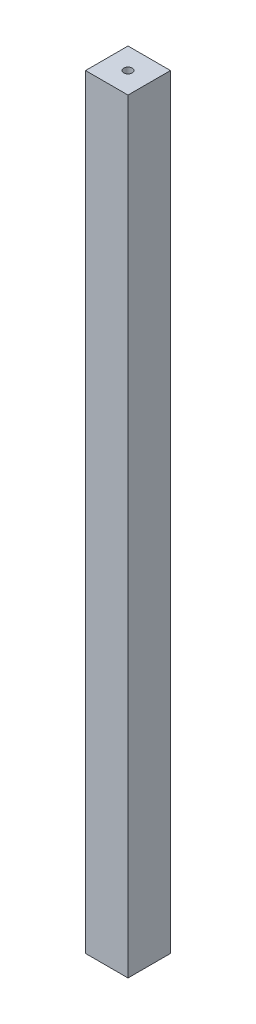
ISO-10303-21;
HEADER;
FILE_DESCRIPTION(('STEP AP214'),'2;1');
FILE_NAME('part.step','',(''),(''),'','','');
FILE_SCHEMA(('AUTOMOTIVE_DESIGN { 1 0 10303 214 1 1 1 1 }'));
ENDSEC;
DATA;
#1=APPLICATION_CONTEXT('core data for automotive mechanical design processes');
#2=APPLICATION_PROTOCOL_DEFINITION('international standard','automotive_design',2000,#1);
#3=PRODUCT_CONTEXT('',#1,'mechanical');
#4=PRODUCT('Part','Part','',(#3));
#5=PRODUCT_RELATED_PRODUCT_CATEGORY('part','',(#4));
#6=PRODUCT_DEFINITION_FORMATION('','',#4);
#7=PRODUCT_DEFINITION_CONTEXT('part definition',#1,'design');
#8=PRODUCT_DEFINITION('design','',#6,#7);
#9=PRODUCT_DEFINITION_SHAPE('','',#8);
#10=(LENGTH_UNIT() NAMED_UNIT(*) SI_UNIT(.MILLI.,.METRE.));
#11=(NAMED_UNIT(*) PLANE_ANGLE_UNIT() SI_UNIT($,.RADIAN.));
#12=(NAMED_UNIT(*) SI_UNIT($,.STERADIAN.) SOLID_ANGLE_UNIT());
#13=UNCERTAINTY_MEASURE_WITH_UNIT(LENGTH_MEASURE(1.E-05),#10,'distance_accuracy_value','');
#14=(GEOMETRIC_REPRESENTATION_CONTEXT(3) GLOBAL_UNCERTAINTY_ASSIGNED_CONTEXT((#13)) GLOBAL_UNIT_ASSIGNED_CONTEXT((#10,
#11,#12)) REPRESENTATION_CONTEXT('',''));
#15=CARTESIAN_POINT('',(0.,0.,0.));
#16=DIRECTION('',(0.,0.,1.));
#17=DIRECTION('',(1.,0.,0.));
#18=AXIS2_PLACEMENT_3D('',#15,#16,#17);
#19=CARTESIAN_POINT('',(25.,900.,-25.));
#20=DIRECTION('',(0.,0.,1.));
#21=DIRECTION('',(1.,0.,0.));
#22=AXIS2_PLACEMENT_3D('',#19,#20,#21);
#23=PLANE('',#22);
#24=DIRECTION('',(-1.,0.,0.));
#25=VECTOR('',#24,1.);
#26=CARTESIAN_POINT('',(25.,0.,-25.));
#27=LINE('',#26,#25);
#28=CARTESIAN_POINT('',(25.,0.,-25.));
#29=VERTEX_POINT('',#28);
#30=CARTESIAN_POINT('',(-25.,0.,-25.));
#31=VERTEX_POINT('',#30);
#32=EDGE_CURVE('E110',#29,#31,#27,.T.);
#33=ORIENTED_EDGE('',*,*,#32,.T.);
#34=DIRECTION('',(0.,-1.,0.));
#35=VECTOR('',#34,1.);
#36=CARTESIAN_POINT('',(-25.,900.,-25.));
#37=LINE('',#36,#35);
#38=CARTESIAN_POINT('',(-25.,900.,-25.));
#39=VERTEX_POINT('',#38);
#40=EDGE_CURVE('E11',#39,#31,#37,.T.);
#41=ORIENTED_EDGE('',*,*,#40,.F.);
#42=DIRECTION('',(-1.,0.,0.));
#43=VECTOR('',#42,1.);
#44=CARTESIAN_POINT('',(25.,900.,-25.));
#45=LINE('',#44,#43);
#46=CARTESIAN_POINT('',(25.,900.,-25.));
#47=VERTEX_POINT('',#46);
#48=EDGE_CURVE('E92',#47,#39,#45,.T.);
#49=ORIENTED_EDGE('',*,*,#48,.F.);
#50=DIRECTION('',(0.,-1.,0.));
#51=VECTOR('',#50,1.);
#52=CARTESIAN_POINT('',(25.,900.,-25.));
#53=LINE('',#52,#51);
#54=EDGE_CURVE('E59',#47,#29,#53,.T.);
#55=ORIENTED_EDGE('',*,*,#54,.T.);
#56=EDGE_LOOP('',(#33,#41,#49,#55));
#57=FACE_BOUND('',#56,.T.);
#58=ADVANCED_FACE('F42',(#57),#23,.F.);
#59=CARTESIAN_POINT('',(-25.,900.,-25.));
#60=DIRECTION('',(1.,0.,0.));
#61=DIRECTION('',(0.,0.,-1.));
#62=AXIS2_PLACEMENT_3D('',#59,#60,#61);
#63=PLANE('',#62);
#64=DIRECTION('',(0.,0.,1.));
#65=VECTOR('',#64,1.);
#66=CARTESIAN_POINT('',(-25.,0.,-25.));
#67=LINE('',#66,#65);
#68=CARTESIAN_POINT('',(-25.,0.,25.));
#69=VERTEX_POINT('',#68);
#70=EDGE_CURVE('E98',#31,#69,#67,.T.);
#71=ORIENTED_EDGE('',*,*,#70,.T.);
#72=DIRECTION('',(0.,-1.,0.));
#73=VECTOR('',#72,1.);
#74=CARTESIAN_POINT('',(-25.,900.,25.));
#75=LINE('',#74,#73);
#76=CARTESIAN_POINT('',(-25.,900.,25.));
#77=VERTEX_POINT('',#76);
#78=EDGE_CURVE('E51',#77,#69,#75,.T.);
#79=ORIENTED_EDGE('',*,*,#78,.F.);
#80=DIRECTION('',(0.,0.,1.));
#81=VECTOR('',#80,1.);
#82=CARTESIAN_POINT('',(-25.,900.,-25.));
#83=LINE('',#82,#81);
#84=EDGE_CURVE('E84',#39,#77,#83,.T.);
#85=ORIENTED_EDGE('',*,*,#84,.F.);
#86=ORIENTED_EDGE('',*,*,#40,.T.);
#87=EDGE_LOOP('',(#71,#79,#85,#86));
#88=FACE_BOUND('',#87,.T.);
#89=ADVANCED_FACE('F97',(#88),#63,.F.);
#90=CARTESIAN_POINT('',(25.,900.,25.));
#91=DIRECTION('',(0.,0.,1.));
#92=DIRECTION('',(1.,0.,0.));
#93=AXIS2_PLACEMENT_3D('',#90,#91,#92);
#94=PLANE('',#93);
#95=DIRECTION('',(-1.,0.,0.));
#96=VECTOR('',#95,1.);
#97=CARTESIAN_POINT('',(25.,0.,25.));
#98=LINE('',#97,#96);
#99=CARTESIAN_POINT('',(25.,0.,25.));
#100=VERTEX_POINT('',#99);
#101=EDGE_CURVE('E116',#100,#69,#98,.T.);
#102=ORIENTED_EDGE('',*,*,#101,.F.);
#103=DIRECTION('',(0.,-1.,0.));
#104=VECTOR('',#103,1.);
#105=CARTESIAN_POINT('',(25.,900.,25.));
#106=LINE('',#105,#104);
#107=CARTESIAN_POINT('',(25.,900.,25.));
#108=VERTEX_POINT('',#107);
#109=EDGE_CURVE('E73',#108,#100,#106,.T.);
#110=ORIENTED_EDGE('',*,*,#109,.F.);
#111=DIRECTION('',(-1.,0.,0.));
#112=VECTOR('',#111,1.);
#113=CARTESIAN_POINT('',(25.,900.,25.));
#114=LINE('',#113,#112);
#115=EDGE_CURVE('E91',#108,#77,#114,.T.);
#116=ORIENTED_EDGE('',*,*,#115,.T.);
#117=ORIENTED_EDGE('',*,*,#78,.T.);
#118=EDGE_LOOP('',(#102,#110,#116,#117));
#119=FACE_BOUND('',#118,.T.);
#120=ADVANCED_FACE('F102',(#119),#94,.T.);
#121=CARTESIAN_POINT('',(25.,900.,-25.));
#122=DIRECTION('',(1.,0.,0.));
#123=DIRECTION('',(0.,0.,-1.));
#124=AXIS2_PLACEMENT_3D('',#121,#122,#123);
#125=PLANE('',#124);
#126=DIRECTION('',(0.,0.,1.));
#127=VECTOR('',#126,1.);
#128=CARTESIAN_POINT('',(25.,0.,-25.));
#129=LINE('',#128,#127);
#130=EDGE_CURVE('E119',#29,#100,#129,.T.);
#131=ORIENTED_EDGE('',*,*,#130,.F.);
#132=ORIENTED_EDGE('',*,*,#54,.F.);
#133=DIRECTION('',(0.,0.,1.));
#134=VECTOR('',#133,1.);
#135=CARTESIAN_POINT('',(25.,900.,-25.));
#136=LINE('',#135,#134);
#137=EDGE_CURVE('E104',#47,#108,#136,.T.);
#138=ORIENTED_EDGE('',*,*,#137,.T.);
#139=ORIENTED_EDGE('',*,*,#109,.T.);
#140=EDGE_LOOP('',(#131,#132,#138,#139));
#141=FACE_BOUND('',#140,.T.);
#142=ADVANCED_FACE('F158',(#141),#125,.T.);
#143=CARTESIAN_POINT('',(0.,900.,0.));
#144=DIRECTION('',(0.,1.,0.));
#145=DIRECTION('',(0.,0.,1.));
#146=AXIS2_PLACEMENT_3D('',#143,#144,#145);
#147=PLANE('',#146);
#148=CARTESIAN_POINT('',(0.,900.,0.));
#149=DIRECTION('',(0.,1.,0.));
#150=DIRECTION('',(0.,0.,1.));
#151=AXIS2_PLACEMENT_3D('',#148,#149,#150);
#152=CIRCLE('',#151,5.);
#153=CARTESIAN_POINT('',(0.,900.,5.));
#154=VERTEX_POINT('',#153);
#155=EDGE_CURVE('E129',#154,#154,#152,.T.);
#156=ORIENTED_EDGE('',*,*,#155,.F.);
#157=EDGE_LOOP('',(#156));
#158=FACE_BOUND('',#157,.T.);
#159=ORIENTED_EDGE('',*,*,#48,.T.);
#160=ORIENTED_EDGE('',*,*,#84,.T.);
#161=ORIENTED_EDGE('',*,*,#115,.F.);
#162=ORIENTED_EDGE('',*,*,#137,.F.);
#163=EDGE_LOOP('',(#159,#160,#161,#162));
#164=FACE_BOUND('',#163,.T.);
#165=ADVANCED_FACE('F88',(#158,#164),#147,.T.);
#166=CARTESIAN_POINT('',(0.,0.,0.));
#167=DIRECTION('',(0.,1.,0.));
#168=DIRECTION('',(0.,0.,1.));
#169=AXIS2_PLACEMENT_3D('',#166,#167,#168);
#170=PLANE('',#169);
#171=CARTESIAN_POINT('',(0.,0.,0.));
#172=DIRECTION('',(0.,-1.,0.));
#173=DIRECTION('',(0.,0.,-1.));
#174=AXIS2_PLACEMENT_3D('',#171,#172,#173);
#175=CIRCLE('',#174,5.);
#176=CARTESIAN_POINT('',(0.,0.,-5.));
#177=VERTEX_POINT('',#176);
#178=EDGE_CURVE('E137',#177,#177,#175,.T.);
#179=ORIENTED_EDGE('',*,*,#178,.F.);
#180=EDGE_LOOP('',(#179));
#181=FACE_BOUND('',#180,.T.);
#182=ORIENTED_EDGE('',*,*,#32,.F.);
#183=ORIENTED_EDGE('',*,*,#130,.T.);
#184=ORIENTED_EDGE('',*,*,#101,.T.);
#185=ORIENTED_EDGE('',*,*,#70,.F.);
#186=EDGE_LOOP('',(#182,#183,#184,#185));
#187=FACE_BOUND('',#186,.T.);
#188=ADVANCED_FACE('F154',(#181,#187),#170,.F.);
#189=CARTESIAN_POINT('',(0.,850.,0.));
#190=DIRECTION('',(0.,1.,0.));
#191=DIRECTION('',(0.,0.,1.));
#192=AXIS2_PLACEMENT_3D('',#189,#190,#191);
#193=CYLINDRICAL_SURFACE('',#192,5.);
#194=CARTESIAN_POINT('',(0.,850.,0.));
#195=DIRECTION('',(0.,1.,0.));
#196=DIRECTION('',(0.,0.,1.));
#197=AXIS2_PLACEMENT_3D('',#194,#195,#196);
#198=CIRCLE('',#197,5.);
#199=CARTESIAN_POINT('',(0.,850.,5.));
#200=VERTEX_POINT('',#199);
#201=EDGE_CURVE('E113',#200,#200,#198,.T.);
#202=ORIENTED_EDGE('',*,*,#201,.F.);
#203=EDGE_LOOP('',(#202));
#204=FACE_BOUND('',#203,.T.);
#205=ORIENTED_EDGE('',*,*,#155,.T.);
#206=EDGE_LOOP('',(#205));
#207=FACE_BOUND('',#206,.T.);
#208=ADVANCED_FACE('F156',(#204,#207),#193,.F.);
#209=CARTESIAN_POINT('',(0.,850.,0.));
#210=DIRECTION('',(0.,1.,0.));
#211=DIRECTION('',(0.,0.,1.));
#212=AXIS2_PLACEMENT_3D('',#209,#210,#211);
#213=PLANE('',#212);
#214=ORIENTED_EDGE('',*,*,#201,.T.);
#215=EDGE_LOOP('',(#214));
#216=FACE_BOUND('',#215,.T.);
#217=ADVANCED_FACE('F150',(#216),#213,.T.);
#218=CARTESIAN_POINT('',(0.,50.,0.));
#219=DIRECTION('',(0.,-1.,0.));
#220=DIRECTION('',(0.,0.,-1.));
#221=AXIS2_PLACEMENT_3D('',#218,#219,#220);
#222=CYLINDRICAL_SURFACE('',#221,5.);
#223=CARTESIAN_POINT('',(0.,50.,0.));
#224=DIRECTION('',(0.,-1.,0.));
#225=DIRECTION('',(0.,0.,-1.));
#226=AXIS2_PLACEMENT_3D('',#223,#224,#225);
#227=CIRCLE('',#226,5.);
#228=CARTESIAN_POINT('',(0.,50.,-5.));
#229=VERTEX_POINT('',#228);
#230=EDGE_CURVE('E133',#229,#229,#227,.T.);
#231=ORIENTED_EDGE('',*,*,#230,.F.);
#232=EDGE_LOOP('',(#231));
#233=FACE_BOUND('',#232,.T.);
#234=ORIENTED_EDGE('',*,*,#178,.T.);
#235=EDGE_LOOP('',(#234));
#236=FACE_BOUND('',#235,.T.);
#237=ADVANCED_FACE('F147',(#233,#236),#222,.F.);
#238=CARTESIAN_POINT('',(0.,50.,0.));
#239=DIRECTION('',(0.,-1.,0.));
#240=DIRECTION('',(0.,0.,-1.));
#241=AXIS2_PLACEMENT_3D('',#238,#239,#240);
#242=PLANE('',#241);
#243=ORIENTED_EDGE('',*,*,#230,.T.);
#244=EDGE_LOOP('',(#243));
#245=FACE_BOUND('',#244,.T.);
#246=ADVANCED_FACE('F145',(#245),#242,.T.);
#247=CLOSED_SHELL('',(#58,#89,#120,#142,#165,#188,#208,#217,#237,#246));
#248=MANIFOLD_SOLID_BREP('B2',#247);
#249=ADVANCED_BREP_SHAPE_REPRESENTATION('',(#18,#248),#14);
#250=SHAPE_DEFINITION_REPRESENTATION(#9,#249);
ENDSEC;
END-ISO-10303-21;
